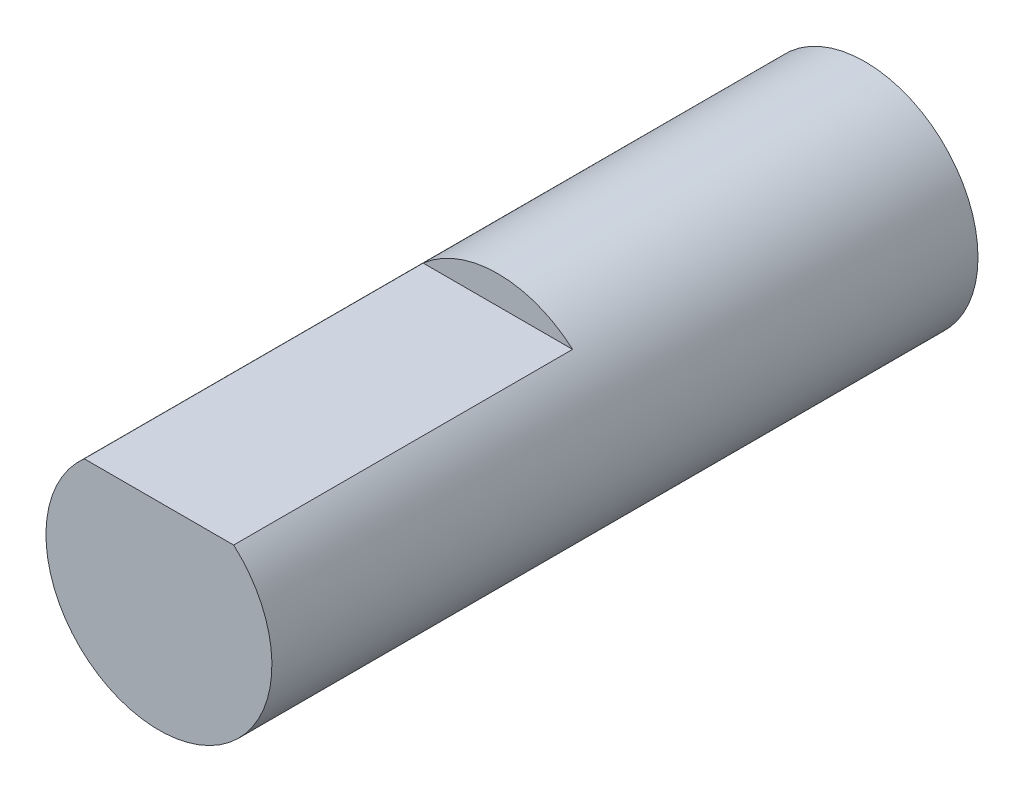
ISO-10303-21;
HEADER;
FILE_DESCRIPTION(('STEP AP214'),'2;1');
FILE_NAME('part.step','',(''),(''),'','','');
FILE_SCHEMA(('AUTOMOTIVE_DESIGN { 1 0 10303 214 1 1 1 1 }'));
ENDSEC;
DATA;
#1=APPLICATION_CONTEXT('core data for automotive mechanical design processes');
#2=APPLICATION_PROTOCOL_DEFINITION('international standard','automotive_design',2000,#1);
#3=PRODUCT_CONTEXT('',#1,'mechanical');
#4=PRODUCT('Part','Part','',(#3));
#5=PRODUCT_RELATED_PRODUCT_CATEGORY('part','',(#4));
#6=PRODUCT_DEFINITION_FORMATION('','',#4);
#7=PRODUCT_DEFINITION_CONTEXT('part definition',#1,'design');
#8=PRODUCT_DEFINITION('design','',#6,#7);
#9=PRODUCT_DEFINITION_SHAPE('','',#8);
#10=(LENGTH_UNIT() NAMED_UNIT(*) SI_UNIT(.MILLI.,.METRE.));
#11=(NAMED_UNIT(*) PLANE_ANGLE_UNIT() SI_UNIT($,.RADIAN.));
#12=(NAMED_UNIT(*) SI_UNIT($,.STERADIAN.) SOLID_ANGLE_UNIT());
#13=UNCERTAINTY_MEASURE_WITH_UNIT(LENGTH_MEASURE(1.E-05),#10,'distance_accuracy_value','');
#14=(GEOMETRIC_REPRESENTATION_CONTEXT(3) GLOBAL_UNCERTAINTY_ASSIGNED_CONTEXT((#13)) GLOBAL_UNIT_ASSIGNED_CONTEXT((#10,
#11,#12)) REPRESENTATION_CONTEXT('',''));
#15=CARTESIAN_POINT('',(0.,0.,0.));
#16=DIRECTION('',(0.,0.,1.));
#17=DIRECTION('',(1.,0.,0.));
#18=AXIS2_PLACEMENT_3D('',#15,#16,#17);
#19=CARTESIAN_POINT('',(0.,0.,25.));
#20=DIRECTION('',(0.,0.,-1.));
#21=DIRECTION('',(-1.,0.,0.));
#22=AXIS2_PLACEMENT_3D('',#19,#20,#21);
#23=CYLINDRICAL_SURFACE('',#22,4.);
#24=CARTESIAN_POINT('',(0.,0.,25.));
#25=DIRECTION('',(0.,0.,1.));
#26=DIRECTION('',(1.,0.,0.));
#27=AXIS2_PLACEMENT_3D('',#24,#25,#26);
#28=CIRCLE('',#27,4.);
#29=CARTESIAN_POINT('',(-2.64575131106459,3.,25.));
#30=VERTEX_POINT('',#29);
#31=CARTESIAN_POINT('',(2.64575131106459,3.,25.));
#32=VERTEX_POINT('',#31);
#33=EDGE_CURVE('E11',#30,#32,#28,.T.);
#34=ORIENTED_EDGE('',*,*,#33,.F.);
#35=DIRECTION('',(0.,0.,1.));
#36=VECTOR('',#35,1.);
#37=CARTESIAN_POINT('',(-2.64575131106459,3.,13.));
#38=LINE('',#37,#36);
#39=CARTESIAN_POINT('',(-2.64575131106459,3.,13.));
#40=VERTEX_POINT('',#39);
#41=EDGE_CURVE('E50',#40,#30,#38,.T.);
#42=ORIENTED_EDGE('',*,*,#41,.F.);
#43=CARTESIAN_POINT('',(0.,0.,13.));
#44=DIRECTION('',(0.,0.,1.));
#45=DIRECTION('',(-1.,0.,0.));
#46=AXIS2_PLACEMENT_3D('',#43,#44,#45);
#47=CIRCLE('',#46,4.);
#48=CARTESIAN_POINT('',(2.64575131106459,3.,13.));
#49=VERTEX_POINT('',#48);
#50=EDGE_CURVE('E65',#49,#40,#47,.T.);
#51=ORIENTED_EDGE('',*,*,#50,.F.);
#52=DIRECTION('',(0.,0.,1.));
#53=VECTOR('',#52,1.);
#54=CARTESIAN_POINT('',(2.64575131106459,3.,13.));
#55=LINE('',#54,#53);
#56=EDGE_CURVE('E56',#49,#32,#55,.T.);
#57=ORIENTED_EDGE('',*,*,#56,.T.);
#58=EDGE_LOOP('',(#34,#42,#51,#57));
#59=FACE_BOUND('',#58,.T.);
#60=CARTESIAN_POINT('',(0.,0.,0.));
#61=DIRECTION('',(0.,0.,1.));
#62=DIRECTION('',(1.,0.,0.));
#63=AXIS2_PLACEMENT_3D('',#60,#61,#62);
#64=CIRCLE('',#63,4.);
#65=CARTESIAN_POINT('',(4.,0.,0.));
#66=VERTEX_POINT('',#65);
#67=EDGE_CURVE('E39',#66,#66,#64,.T.);
#68=ORIENTED_EDGE('',*,*,#67,.T.);
#69=EDGE_LOOP('',(#68));
#70=FACE_BOUND('',#69,.T.);
#71=ADVANCED_FACE('F36',(#59,#70),#23,.T.);
#72=CARTESIAN_POINT('',(0.,0.,25.));
#73=DIRECTION('',(0.,0.,1.));
#74=DIRECTION('',(1.,0.,0.));
#75=AXIS2_PLACEMENT_3D('',#72,#73,#74);
#76=PLANE('',#75);
#77=DIRECTION('',(1.,0.,0.));
#78=VECTOR('',#77,1.);
#79=CARTESIAN_POINT('',(-2.64575131106459,3.,25.));
#80=LINE('',#79,#78);
#81=EDGE_CURVE('E61',#30,#32,#80,.T.);
#82=ORIENTED_EDGE('',*,*,#81,.F.);
#83=ORIENTED_EDGE('',*,*,#33,.T.);
#84=EDGE_LOOP('',(#82,#83));
#85=FACE_BOUND('',#84,.T.);
#86=ADVANCED_FACE('F71',(#85),#76,.T.);
#87=CARTESIAN_POINT('',(0.,0.,0.));
#88=DIRECTION('',(0.,0.,1.));
#89=DIRECTION('',(1.,0.,0.));
#90=AXIS2_PLACEMENT_3D('',#87,#88,#89);
#91=PLANE('',#90);
#92=ORIENTED_EDGE('',*,*,#67,.F.);
#93=EDGE_LOOP('',(#92));
#94=FACE_BOUND('',#93,.T.);
#95=ADVANCED_FACE('F73',(#94),#91,.F.);
#96=CARTESIAN_POINT('',(-2.64575131106459,3.,13.));
#97=DIRECTION('',(0.,-1.,0.));
#98=DIRECTION('',(0.,0.,-1.));
#99=AXIS2_PLACEMENT_3D('',#96,#97,#98);
#100=PLANE('',#99);
#101=ORIENTED_EDGE('',*,*,#81,.T.);
#102=ORIENTED_EDGE('',*,*,#56,.F.);
#103=DIRECTION('',(1.,0.,0.));
#104=VECTOR('',#103,1.);
#105=CARTESIAN_POINT('',(-2.64575131106459,3.,13.));
#106=LINE('',#105,#104);
#107=EDGE_CURVE('E88',#40,#49,#106,.T.);
#108=ORIENTED_EDGE('',*,*,#107,.F.);
#109=ORIENTED_EDGE('',*,*,#41,.T.);
#110=EDGE_LOOP('',(#101,#102,#108,#109));
#111=FACE_BOUND('',#110,.T.);
#112=ADVANCED_FACE('F62',(#111),#100,.F.);
#113=CARTESIAN_POINT('',(0.,0.,13.));
#114=DIRECTION('',(0.,0.,-1.));
#115=DIRECTION('',(-1.,0.,0.));
#116=AXIS2_PLACEMENT_3D('',#113,#114,#115);
#117=PLANE('',#116);
#118=ORIENTED_EDGE('',*,*,#50,.T.);
#119=ORIENTED_EDGE('',*,*,#107,.T.);
#120=EDGE_LOOP('',(#118,#119));
#121=FACE_BOUND('',#120,.T.);
#122=ADVANCED_FACE('F83',(#121),#117,.F.);
#123=CLOSED_SHELL('',(#71,#86,#95,#112,#122));
#124=MANIFOLD_SOLID_BREP('B2',#123);
#125=ADVANCED_BREP_SHAPE_REPRESENTATION('',(#18,#124),#14);
#126=SHAPE_DEFINITION_REPRESENTATION(#9,#125);
ENDSEC;
END-ISO-10303-21;
